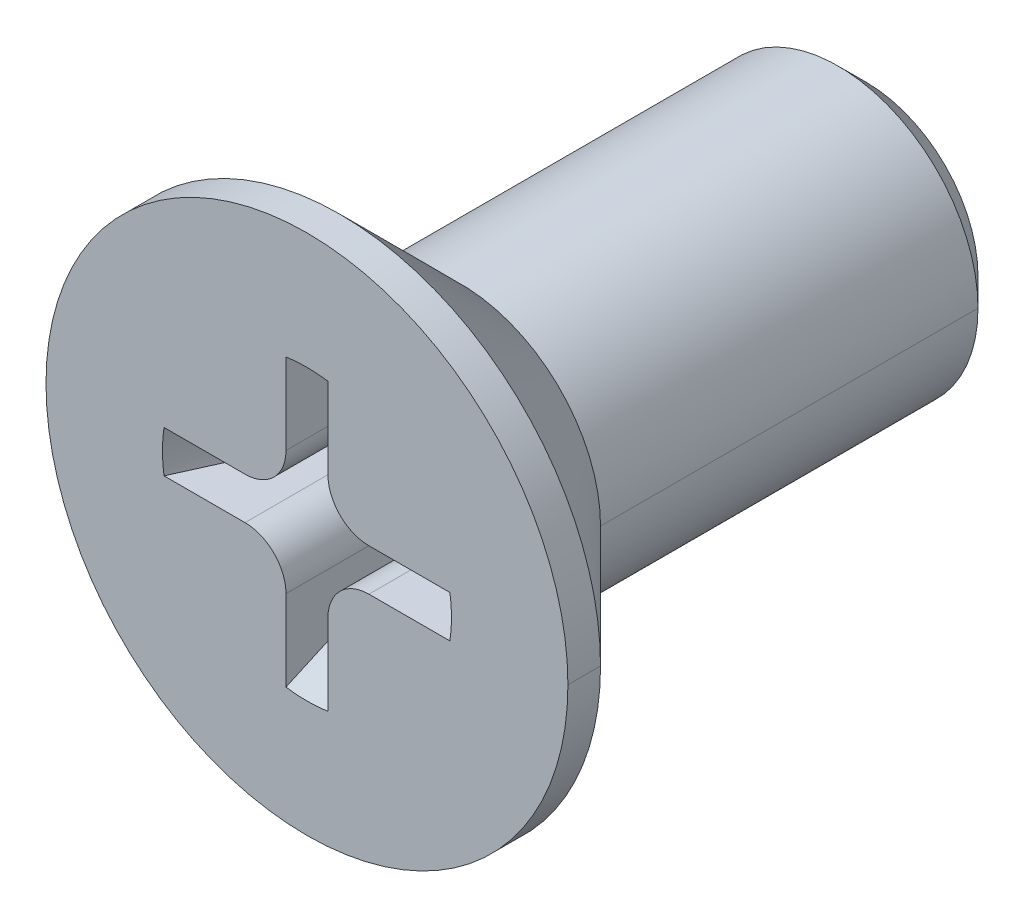
ISO-10303-21;
HEADER;
FILE_DESCRIPTION(('STEP AP214'),'2;1');
FILE_NAME('part.step','',(''),(''),'','','');
FILE_SCHEMA(('AUTOMOTIVE_DESIGN { 1 0 10303 214 1 1 1 1 }'));
ENDSEC;
DATA;
#1=APPLICATION_CONTEXT('core data for automotive mechanical design processes');
#2=APPLICATION_PROTOCOL_DEFINITION('international standard','automotive_design',2000,#1);
#3=PRODUCT_CONTEXT('',#1,'mechanical');
#4=PRODUCT('Part','Part','',(#3));
#5=PRODUCT_RELATED_PRODUCT_CATEGORY('part','',(#4));
#6=PRODUCT_DEFINITION_FORMATION('','',#4);
#7=PRODUCT_DEFINITION_CONTEXT('part definition',#1,'design');
#8=PRODUCT_DEFINITION('design','',#6,#7);
#9=PRODUCT_DEFINITION_SHAPE('','',#8);
#10=(LENGTH_UNIT() NAMED_UNIT(*) SI_UNIT(.MILLI.,.METRE.));
#11=(NAMED_UNIT(*) PLANE_ANGLE_UNIT() SI_UNIT($,.RADIAN.));
#12=(NAMED_UNIT(*) SI_UNIT($,.STERADIAN.) SOLID_ANGLE_UNIT());
#13=UNCERTAINTY_MEASURE_WITH_UNIT(LENGTH_MEASURE(1.E-05),#10,'distance_accuracy_value','');
#14=(GEOMETRIC_REPRESENTATION_CONTEXT(3) GLOBAL_UNCERTAINTY_ASSIGNED_CONTEXT((#13)) GLOBAL_UNIT_ASSIGNED_CONTEXT((#10,
#11,#12)) REPRESENTATION_CONTEXT('',''));
#15=CARTESIAN_POINT('',(0.,0.,0.));
#16=DIRECTION('',(0.,0.,1.));
#17=DIRECTION('',(1.,0.,0.));
#18=AXIS2_PLACEMENT_3D('',#15,#16,#17);
#19=CARTESIAN_POINT('',(0.,0.,1.65));
#20=DIRECTION('',(0.,0.,1.));
#21=DIRECTION('',(1.,0.,0.));
#22=AXIS2_PLACEMENT_3D('',#19,#20,#21);
#23=PLANE('',#22);
#24=CARTESIAN_POINT('',(0.665002947104029,-0.665002947104029,1.65));
#25=DIRECTION('',(0.,0.,-1.));
#26=DIRECTION('',(-0.999999999977569,6.69791883928813E-06,0.));
#27=AXIS2_PLACEMENT_3D('',#24,#25,#26);
#28=CIRCLE('',#27,0.440002947113899);
#29=CARTESIAN_POINT('',(0.225,-0.665,1.65));
#30=VERTEX_POINT('',#29);
#31=CARTESIAN_POINT('',(0.665,-0.225,1.65));
#32=VERTEX_POINT('',#31);
#33=EDGE_CURVE('E11',#30,#32,#28,.T.);
#34=ORIENTED_EDGE('',*,*,#33,.F.);
#35=DIRECTION('',(0.,1.,0.));
#36=VECTOR('',#35,1.);
#37=CARTESIAN_POINT('',(0.225,-1.5335824073065,1.65));
#38=LINE('',#37,#36);
#39=CARTESIAN_POINT('',(0.225000000000073,-1.53358240730625,1.6500000000001));
#40=VERTEX_POINT('',#39);
#41=EDGE_CURVE('E27',#40,#30,#38,.T.);
#42=ORIENTED_EDGE('',*,*,#41,.F.);
#43=CARTESIAN_POINT('',(-1.6623985635289E-07,2.27828563326149E-06,1.65));
#44=DIRECTION('',(0.,0.,1.));
#45=DIRECTION('',(1.07251362713848E-07,-1.,0.));
#46=AXIS2_PLACEMENT_3D('',#43,#44,#45);
#47=CIRCLE('',#46,1.55000227828564);
#48=CARTESIAN_POINT('',(0.,-1.55,1.65));
#49=VERTEX_POINT('',#48);
#50=EDGE_CURVE('E582',#49,#40,#47,.T.);
#51=ORIENTED_EDGE('',*,*,#50,.F.);
#52=CARTESIAN_POINT('',(1.66239870834362E-07,2.27828614085545E-06,1.65));
#53=DIRECTION('',(0.,0.,1.));
#54=DIRECTION('',(-0.145161184207197,-0.989408020282615,0.));
#55=AXIS2_PLACEMENT_3D('',#52,#53,#54);
#56=CIRCLE('',#55,1.55000227828615);
#57=CARTESIAN_POINT('',(-0.225,-1.53358240730663,1.65));
#58=VERTEX_POINT('',#57);
#59=EDGE_CURVE('E591',#58,#49,#56,.T.);
#60=ORIENTED_EDGE('',*,*,#59,.F.);
#61=DIRECTION('',(0.,-1.,0.));
#62=VECTOR('',#61,1.);
#63=CARTESIAN_POINT('',(-0.225,-0.665,1.65));
#64=LINE('',#63,#62);
#65=CARTESIAN_POINT('',(-0.225,-0.665,1.65));
#66=VERTEX_POINT('',#65);
#67=EDGE_CURVE('E583',#66,#58,#64,.T.);
#68=ORIENTED_EDGE('',*,*,#67,.F.);
#69=CARTESIAN_POINT('',(-0.665002947104029,-0.665002947104029,1.65));
#70=DIRECTION('',(0.,0.,-1.));
#71=DIRECTION('',(6.69791883928813E-06,0.999999999977569,0.));
#72=AXIS2_PLACEMENT_3D('',#69,#70,#71);
#73=CIRCLE('',#72,0.440002947113899);
#74=CARTESIAN_POINT('',(-0.665,-0.225,1.65));
#75=VERTEX_POINT('',#74);
#76=EDGE_CURVE('E588',#75,#66,#73,.T.);
#77=ORIENTED_EDGE('',*,*,#76,.F.);
#78=DIRECTION('',(1.,0.,0.));
#79=VECTOR('',#78,1.);
#80=CARTESIAN_POINT('',(-1.5335824073065,-0.225,1.65));
#81=LINE('',#80,#79);
#82=CARTESIAN_POINT('',(-1.53358240730626,-0.224999999999949,1.6500000000001));
#83=VERTEX_POINT('',#82);
#84=EDGE_CURVE('E621',#83,#75,#81,.T.);
#85=ORIENTED_EDGE('',*,*,#84,.F.);
#86=CARTESIAN_POINT('',(2.27828646104377E-06,1.66239894017206E-07,1.65));
#87=DIRECTION('',(0.,0.,1.));
#88=DIRECTION('',(-1.,-1.07251387013314E-07,0.));
#89=AXIS2_PLACEMENT_3D('',#86,#87,#88);
#90=CIRCLE('',#89,1.55000227828647);
#91=CARTESIAN_POINT('',(-1.55,0.,1.65));
#92=VERTEX_POINT('',#91);
#93=EDGE_CURVE('E614',#92,#83,#90,.T.);
#94=ORIENTED_EDGE('',*,*,#93,.F.);
#95=CARTESIAN_POINT('',(2.278286163504E-06,-1.66239872465001E-07,1.65));
#96=DIRECTION('',(0.,0.,1.));
#97=DIRECTION('',(-0.989408020282615,0.145161184207196,0.));
#98=AXIS2_PLACEMENT_3D('',#95,#96,#97);
#99=CIRCLE('',#98,1.55000227828617);
#100=CARTESIAN_POINT('',(-1.53358240730663,0.225,1.65));
#101=VERTEX_POINT('',#100);
#102=EDGE_CURVE('E797',#101,#92,#99,.T.);
#103=ORIENTED_EDGE('',*,*,#102,.F.);
#104=DIRECTION('',(-1.,0.,0.));
#105=VECTOR('',#104,1.);
#106=CARTESIAN_POINT('',(-0.665,0.225,1.65));
#107=LINE('',#106,#105);
#108=CARTESIAN_POINT('',(-0.665,0.225,1.65));
#109=VERTEX_POINT('',#108);
#110=EDGE_CURVE('E670',#109,#101,#107,.T.);
#111=ORIENTED_EDGE('',*,*,#110,.F.);
#112=CARTESIAN_POINT('',(-0.665002947104029,0.665002947104029,1.65));
#113=DIRECTION('',(0.,0.,-1.));
#114=DIRECTION('',(0.999999999977569,-6.69791883903581E-06,0.));
#115=AXIS2_PLACEMENT_3D('',#112,#113,#114);
#116=CIRCLE('',#115,0.440002947113898);
#117=CARTESIAN_POINT('',(-0.225,0.665,1.65));
#118=VERTEX_POINT('',#117);
#119=EDGE_CURVE('E395',#118,#109,#116,.T.);
#120=ORIENTED_EDGE('',*,*,#119,.F.);
#121=DIRECTION('',(0.,-1.,0.));
#122=VECTOR('',#121,1.);
#123=CARTESIAN_POINT('',(-0.225,1.5335824073065,1.65));
#124=LINE('',#123,#122);
#125=CARTESIAN_POINT('',(-0.224999999999949,1.53358240730626,1.6500000000001));
#126=VERTEX_POINT('',#125);
#127=EDGE_CURVE('E392',#126,#118,#124,.T.);
#128=ORIENTED_EDGE('',*,*,#127,.F.);
#129=CARTESIAN_POINT('',(1.6623989204656E-07,-2.27828643373229E-06,1.65));
#130=DIRECTION('',(0.,0.,1.));
#131=DIRECTION('',(-1.07251385741933E-07,1.,0.));
#132=AXIS2_PLACEMENT_3D('',#129,#130,#131);
#133=CIRCLE('',#132,1.55000227828644);
#134=CARTESIAN_POINT('',(0.,1.55,1.65));
#135=VERTEX_POINT('',#134);
#136=EDGE_CURVE('E399',#135,#126,#133,.T.);
#137=ORIENTED_EDGE('',*,*,#136,.F.);
#138=CARTESIAN_POINT('',(-1.66239870938445E-07,-2.27828614218773E-06,1.65));
#139=DIRECTION('',(0.,0.,1.));
#140=DIRECTION('',(0.145161184207197,0.989408020282615,0.));
#141=AXIS2_PLACEMENT_3D('',#138,#139,#140);
#142=CIRCLE('',#141,1.55000227828615);
#143=CARTESIAN_POINT('',(0.225,1.53358240730663,1.65));
#144=VERTEX_POINT('',#143);
#145=EDGE_CURVE('E174',#144,#135,#142,.T.);
#146=ORIENTED_EDGE('',*,*,#145,.F.);
#147=DIRECTION('',(0.,1.,0.));
#148=VECTOR('',#147,1.);
#149=CARTESIAN_POINT('',(0.225,0.665,1.65));
#150=LINE('',#149,#148);
#151=CARTESIAN_POINT('',(0.225,0.665,1.65));
#152=VERTEX_POINT('',#151);
#153=EDGE_CURVE('E167',#152,#144,#150,.T.);
#154=ORIENTED_EDGE('',*,*,#153,.F.);
#155=CARTESIAN_POINT('',(0.665002947104029,0.665002947104029,1.65));
#156=DIRECTION('',(0.,0.,-1.));
#157=DIRECTION('',(-6.69791883928813E-06,-0.999999999977569,0.));
#158=AXIS2_PLACEMENT_3D('',#155,#156,#157);
#159=CIRCLE('',#158,0.440002947113899);
#160=CARTESIAN_POINT('',(0.665,0.225,1.65));
#161=VERTEX_POINT('',#160);
#162=EDGE_CURVE('E190',#161,#152,#159,.T.);
#163=ORIENTED_EDGE('',*,*,#162,.F.);
#164=DIRECTION('',(-1.,0.,0.));
#165=VECTOR('',#164,1.);
#166=CARTESIAN_POINT('',(1.5335824073065,0.225,1.65));
#167=LINE('',#166,#165);
#168=CARTESIAN_POINT('',(1.53358240730626,0.224999999999948,1.6500000000001));
#169=VERTEX_POINT('',#168);
#170=EDGE_CURVE('E265',#169,#161,#167,.T.);
#171=ORIENTED_EDGE('',*,*,#170,.F.);
#172=CARTESIAN_POINT('',(-2.27828557486376E-06,-1.66239852050776E-07,1.65));
#173=DIRECTION('',(0.,0.,1.));
#174=DIRECTION('',(1.,1.07251359938298E-07,0.));
#175=AXIS2_PLACEMENT_3D('',#172,#173,#174);
#176=CIRCLE('',#175,1.55000227828558);
#177=CARTESIAN_POINT('',(1.54999999999976,0.,1.6500000000001));
#178=VERTEX_POINT('',#177);
#179=EDGE_CURVE('E254',#178,#169,#176,.T.);
#180=ORIENTED_EDGE('',*,*,#179,.F.);
#181=CARTESIAN_POINT('',(-2.27828558885257E-06,1.66239853251204E-07,1.65));
#182=DIRECTION('',(0.,0.,1.));
#183=DIRECTION('',(0.98940802028261,-0.145161184207237,0.));
#184=AXIS2_PLACEMENT_3D('',#181,#182,#183);
#185=CIRCLE('',#184,1.5500022782856);
#186=CARTESIAN_POINT('',(1.53358240730663,-0.225,1.65));
#187=VERTEX_POINT('',#186);
#188=EDGE_CURVE('E471',#187,#178,#185,.T.);
#189=ORIENTED_EDGE('',*,*,#188,.F.);
#190=DIRECTION('',(1.,0.,0.));
#191=VECTOR('',#190,1.);
#192=CARTESIAN_POINT('',(0.665,-0.225,1.65));
#193=LINE('',#192,#191);
#194=EDGE_CURVE('E478',#32,#187,#193,.T.);
#195=ORIENTED_EDGE('',*,*,#194,.F.);
#196=EDGE_LOOP('',(#34,#42,#51,#60,#68,#77,#85,#94,#103,#111,#120,#128,#137,#146,#154,#163,#171,
#180,#189,#195));
#197=FACE_BOUND('',#196,.T.);
#198=CARTESIAN_POINT('',(0.,0.,1.65));
#199=DIRECTION('',(0.,0.,-1.));
#200=DIRECTION('',(1.,0.,0.));
#201=AXIS2_PLACEMENT_3D('',#198,#199,#200);
#202=CIRCLE('',#201,2.8);
#203=CARTESIAN_POINT('',(2.8,0.,1.65));
#204=VERTEX_POINT('',#203);
#205=CARTESIAN_POINT('',(-2.8,0.,1.65));
#206=VERTEX_POINT('',#205);
#207=EDGE_CURVE('E442',#204,#206,#202,.T.);
#208=ORIENTED_EDGE('',*,*,#207,.F.);
#209=CARTESIAN_POINT('',(0.,0.,1.65));
#210=DIRECTION('',(0.,0.,-1.));
#211=DIRECTION('',(-1.,0.,0.));
#212=AXIS2_PLACEMENT_3D('',#209,#210,#211);
#213=CIRCLE('',#212,2.8);
#214=EDGE_CURVE('E460',#206,#204,#213,.T.);
#215=ORIENTED_EDGE('',*,*,#214,.F.);
#216=EDGE_LOOP('',(#208,#215));
#217=FACE_BOUND('',#216,.T.);
#218=ADVANCED_FACE('F16',(#197,#217),#23,.T.);
#219=CARTESIAN_POINT('',(0.665,-0.665,-0.35));
#220=DIRECTION('',(0.,0.,1.));
#221=DIRECTION('',(1.,0.,0.));
#222=AXIS2_PLACEMENT_3D('',#219,#220,#221);
#223=CYLINDRICAL_SURFACE('',#222,0.44);
#224=CARTESIAN_POINT('',(0.664977290622299,-0.664977284049876,-0.35));
#225=DIRECTION('',(0.,0.,-1.));
#226=DIRECTION('',(0.707206493153023,0.707007055157304,0.));
#227=AXIS2_PLACEMENT_3D('',#224,#225,#226);
#228=ELLIPSE('',#227,0.439987856251321,0.439966630410474);
#229=CARTESIAN_POINT('',(0.227347754998727,-0.619607132219182,-0.35));
#230=VERTEX_POINT('',#229);
#231=CARTESIAN_POINT('',(0.61960713221919,-0.227347754998725,-0.35));
#232=VERTEX_POINT('',#231);
#233=EDGE_CURVE('E652',#230,#232,#228,.T.);
#234=ORIENTED_EDGE('',*,*,#233,.F.);
#235=CARTESIAN_POINT('',(0.225,-0.665,-0.25554435333));
#236=CARTESIAN_POINT('',(0.224997571030968,-0.65997447042085,-0.266255527915319));
#237=CARTESIAN_POINT('',(0.225172256916278,-0.649935604485502,-0.287478048101881));
#238=CARTESIAN_POINT('',(0.225949123875576,-0.634798395531344,-0.318967052463015));
#239=CARTESIAN_POINT('',(0.226825774706782,-0.624664497369858,-0.339721775285891));
#240=CARTESIAN_POINT('',(0.227347754998772,-0.619607132218977,-0.35));
#241=(BOUNDED_CURVE() B_SPLINE_CURVE(3,(#235,#236,#237,#238,#239,#240),.UNSPECIFIED.,.F.,
.F.) B_SPLINE_CURVE_WITH_KNOTS((4,1,1,4),(0.,0.338549547031321,0.6718829113483,1.),
.UNSPECIFIED.) CURVE() GEOMETRIC_REPRESENTATION_ITEM() RATIONAL_B_SPLINE_CURVE((1.,1.,1.,1.,1.,1.)) REPRESENTATION_ITEM(''));
#242=CARTESIAN_POINT('',(0.225000000000029,-0.664999999998278,-0.25554435333355));
#243=VERTEX_POINT('',#242);
#244=EDGE_CURVE('E527',#243,#230,#241,.T.);
#245=ORIENTED_EDGE('',*,*,#244,.F.);
#246=DIRECTION('',(0.,0.,-1.));
#247=VECTOR('',#246,1.);
#248=CARTESIAN_POINT('',(0.225,-0.665,1.65));
#249=LINE('',#248,#247);
#250=EDGE_CURVE('E732',#30,#243,#249,.T.);
#251=ORIENTED_EDGE('',*,*,#250,.F.);
#252=ORIENTED_EDGE('',*,*,#33,.T.);
#253=DIRECTION('',(0.,0.,1.));
#254=VECTOR('',#253,1.);
#255=CARTESIAN_POINT('',(0.665,-0.225,-0.25554435333));
#256=LINE('',#255,#254);
#257=CARTESIAN_POINT('',(0.665,-0.225,-0.255544353330121));
#258=VERTEX_POINT('',#257);
#259=EDGE_CURVE('E472',#258,#32,#256,.T.);
#260=ORIENTED_EDGE('',*,*,#259,.F.);
#261=CARTESIAN_POINT('',(0.619607132218976,-0.227347754998772,-0.35));
#262=CARTESIAN_POINT('',(0.624664497369473,-0.226825774706822,-0.339721775286733));
#263=CARTESIAN_POINT('',(0.634798395530588,-0.225949123875634,-0.318967052464709));
#264=CARTESIAN_POINT('',(0.649935604484744,-0.225172256916297,-0.287478048103574));
#265=CARTESIAN_POINT('',(0.659974470420473,-0.224997571030967,-0.266255527916167));
#266=CARTESIAN_POINT('',(0.665,-0.225,-0.25554435333));
#267=(BOUNDED_CURVE() B_SPLINE_CURVE(3,(#261,#262,#263,#264,#265,#266),.UNSPECIFIED.,.F.,
.F.) B_SPLINE_CURVE_WITH_KNOTS((4,1,1,4),(0.,0.328117088625176,0.661450452942137,1.),
.UNSPECIFIED.) CURVE() GEOMETRIC_REPRESENTATION_ITEM() RATIONAL_B_SPLINE_CURVE((1.,1.,1.,1.,1.,1.)) REPRESENTATION_ITEM(''));
#268=EDGE_CURVE('E270',#232,#258,#267,.T.);
#269=ORIENTED_EDGE('',*,*,#268,.F.);
#270=EDGE_LOOP('',(#234,#245,#251,#252,#260,#269));
#271=FACE_BOUND('',#270,.T.);
#272=ADVANCED_FACE('F314',(#271),#223,.T.);
#273=CARTESIAN_POINT('',(0.225,-0.665,-0.35));
#274=DIRECTION('',(1.,0.,0.));
#275=DIRECTION('',(0.,-1.,0.));
#276=AXIS2_PLACEMENT_3D('',#273,#274,#275);
#277=PLANE('',#276);
#278=ORIENTED_EDGE('',*,*,#41,.T.);
#279=ORIENTED_EDGE('',*,*,#250,.T.);
#280=CARTESIAN_POINT('',(0.225,-0.664999999994835,-0.25554435334065));
#281=CARTESIAN_POINT('',(0.225,-0.953573853390657,0.35986159446315));
#282=CARTESIAN_POINT('',(0.225,-1.53358240730574,1.65000000000032));
#283=B_SPLINE_CURVE_WITH_KNOTS('',2,(#280,#281,#282),.UNSPECIFIED.,.F.,.F.,(3,3),(0.,1.),.UNSPECIFIED.);
#284=EDGE_CURVE('E511',#243,#40,#283,.T.);
#285=ORIENTED_EDGE('',*,*,#284,.T.);
#286=EDGE_LOOP('',(#278,#279,#285));
#287=FACE_BOUND('',#286,.T.);
#288=ADVANCED_FACE('F317',(#287),#277,.F.);
#289=CARTESIAN_POINT('',(0.,0.,0.414044943820969));
#290=DIRECTION('',(0.,0.,1.));
#291=DIRECTION('',(1.,0.,0.));
#292=AXIS2_PLACEMENT_3D('',#289,#290,#291);
#293=CONICAL_SURFACE('',#292,1.,0.418688151438);
#294=ORIENTED_EDGE('',*,*,#244,.T.);
#295=CARTESIAN_POINT('',(0.,9.42262228920132E-06,-0.35));
#296=DIRECTION('',(0.,0.,1.));
#297=DIRECTION('',(-0.344461678646605,-0.938800379177577,0.));
#298=AXIS2_PLACEMENT_3D('',#295,#296,#297);
#299=CIRCLE('',#298,0.660008845953364);
#300=CARTESIAN_POINT('',(-0.227347754998727,-0.619607132219182,-0.35));
#301=VERTEX_POINT('',#300);
#302=EDGE_CURVE('E654',#301,#230,#299,.T.);
#303=ORIENTED_EDGE('',*,*,#302,.F.);
#304=CARTESIAN_POINT('',(-0.227347754998772,-0.619607132218976,-0.35));
#305=CARTESIAN_POINT('',(-0.226825774761878,-0.624664496662959,-0.339721774741337));
#306=CARTESIAN_POINT('',(-0.225949124010801,-0.634798393838425,-0.31896705123648));
#307=CARTESIAN_POINT('',(-0.225172256955513,-0.649935602794808,-0.287478046895877));
#308=CARTESIAN_POINT('',(-0.224997571049289,-0.659974469699923,-0.266255527370977));
#309=CARTESIAN_POINT('',(-0.225,-0.665,-0.25554435333));
#310=(BOUNDED_CURVE() B_SPLINE_CURVE(3,(#304,#305,#306,#307,#308,#309),.UNSPECIFIED.,.F.,
.F.) B_SPLINE_CURVE_WITH_KNOTS((4,1,1,4),(0.,0.328117093794362,0.66145045814854,1.),
.UNSPECIFIED.) CURVE() GEOMETRIC_REPRESENTATION_ITEM() RATIONAL_B_SPLINE_CURVE((1.,1.,1.,1.,1.,1.)) REPRESENTATION_ITEM(''));
#311=CARTESIAN_POINT('',(-0.225,-0.665,-0.255544353330121));
#312=VERTEX_POINT('',#311);
#313=EDGE_CURVE('E564',#301,#312,#310,.T.);
#314=ORIENTED_EDGE('',*,*,#313,.T.);
#315=CARTESIAN_POINT('',(-0.224999999999924,-0.664999999999773,-0.255544353330256));
#316=CARTESIAN_POINT('',(-0.225039006148654,-0.695463201823479,-0.19064683696447));
#317=CARTESIAN_POINT('',(-0.225086501672703,-0.725767506974524,-0.125675169622548));
#318=CARTESIAN_POINT('',(-0.225171058228035,-0.790505041385292,0.0137910008785289));
#319=CARTESIAN_POINT('',(-0.225205614164587,-0.824901066167323,0.0883027847754375));
#320=CARTESIAN_POINT('',(-0.225203785316268,-0.897833980861553,0.246846581908908));
#321=CARTESIAN_POINT('',(-0.225157875366268,-0.936344379953647,0.330890759752385));
#322=CARTESIAN_POINT('',(-0.225060542602073,-1.01748670986774,0.508505940217321));
#323=CARTESIAN_POINT('',(-0.225009079481206,-1.06009600758011,0.602087281109612));
#324=CARTESIAN_POINT('',(-0.224992614834694,-1.1343516547518,0.765577847910059));
#325=CARTESIAN_POINT('',(-0.225008990381767,-1.16603681662718,0.835469458075799));
#326=CARTESIAN_POINT('',(-0.225030923079399,-1.23223109922416,0.981672112662301));
#327=CARTESIAN_POINT('',(-0.225035354838135,-1.26673367839136,1.05798611842399));
#328=CARTESIAN_POINT('',(-0.225033062119772,-1.33856140035044,1.21703459776615));
#329=CARTESIAN_POINT('',(-0.225025372364861,-1.37588096477277,1.29977159000752));
#330=CARTESIAN_POINT('',(-0.22500917770224,-1.45334003480729,1.47166689740909));
#331=CARTESIAN_POINT('',(-0.225000655718692,-1.49347462962998,1.56082742568455));
#332=CARTESIAN_POINT('',(-0.224999999999854,-1.53358240730586,1.65000000000047));
#333=B_SPLINE_CURVE_WITH_KNOTS('',3,(#315,#316,#317,#318,#319,#320,#321,#322,#323,#324,#325,
#326,#327,#328,#329,#330,#331,#332),.UNSPECIFIED.,.F.,.F.,(4,2,2,2,2,2,2,2,4),(0.,
0.215074239227004,0.461276463354804,0.738617679825519,1.04709299854529,1.27730824681175,
1.52856166373092,1.80085456485191,2.09418619692445),.UNSPECIFIED.);
#334=EDGE_CURVE('E559',#312,#58,#333,.T.);
#335=ORIENTED_EDGE('',*,*,#334,.T.);
#336=ORIENTED_EDGE('',*,*,#59,.T.);
#337=ORIENTED_EDGE('',*,*,#50,.T.);
#338=ORIENTED_EDGE('',*,*,#284,.F.);
#339=EDGE_LOOP('',(#294,#303,#314,#335,#336,#337,#338));
#340=FACE_BOUND('',#339,.T.);
#341=ADVANCED_FACE('F529',(#340),#293,.F.);
#342=CARTESIAN_POINT('',(-0.225,-1.55,-0.35));
#343=DIRECTION('',(-1.,0.,0.));
#344=DIRECTION('',(0.,1.,0.));
#345=AXIS2_PLACEMENT_3D('',#342,#343,#344);
#346=PLANE('',#345);
#347=DIRECTION('',(0.,0.,1.));
#348=VECTOR('',#347,1.);
#349=CARTESIAN_POINT('',(-0.225,-0.665,-0.25554435333));
#350=LINE('',#349,#348);
#351=EDGE_CURVE('E576',#312,#66,#350,.T.);
#352=ORIENTED_EDGE('',*,*,#351,.T.);
#353=ORIENTED_EDGE('',*,*,#67,.T.);
#354=ORIENTED_EDGE('',*,*,#334,.F.);
#355=EDGE_LOOP('',(#352,#353,#354));
#356=FACE_BOUND('',#355,.T.);
#357=ADVANCED_FACE('F539',(#356),#346,.F.);
#358=CARTESIAN_POINT('',(-0.665,-0.665,-0.35));
#359=DIRECTION('',(0.,0.,1.));
#360=DIRECTION('',(1.,0.,0.));
#361=AXIS2_PLACEMENT_3D('',#358,#359,#360);
#362=CYLINDRICAL_SURFACE('',#361,0.44);
#363=CARTESIAN_POINT('',(-0.664977284049926,-0.664977290622335,-0.35));
#364=DIRECTION('',(0.,0.,-1.));
#365=DIRECTION('',(-0.707007055323126,0.707206492987248,0.));
#366=AXIS2_PLACEMENT_3D('',#363,#364,#365);
#367=ELLIPSE('',#366,0.439987856251347,0.439966630410535);
#368=CARTESIAN_POINT('',(-0.61960713221919,-0.227347754998725,-0.35));
#369=VERTEX_POINT('',#368);
#370=EDGE_CURVE('E655',#369,#301,#367,.T.);
#371=ORIENTED_EDGE('',*,*,#370,.F.);
#372=CARTESIAN_POINT('',(-0.665,-0.225,-0.25554435333));
#373=CARTESIAN_POINT('',(-0.659974470421008,-0.224997571030964,-0.266255527915444));
#374=CARTESIAN_POINT('',(-0.649935604485872,-0.22517225691627,-0.287478048102156));
#375=CARTESIAN_POINT('',(-0.634798395531756,-0.225949123875543,-0.318967052463315));
#376=CARTESIAN_POINT('',(-0.624664497370031,-0.226825774706769,-0.339721775286023));
#377=CARTESIAN_POINT('',(-0.619607132218977,-0.227347754998772,-0.35));
#378=(BOUNDED_CURVE() B_SPLINE_CURVE(3,(#372,#373,#374,#375,#376,#377),.UNSPECIFIED.,.F.,
.F.) B_SPLINE_CURVE_WITH_KNOTS((4,1,1,4),(0.,0.338549547032616,0.671882911349549,1.),
.UNSPECIFIED.) CURVE() GEOMETRIC_REPRESENTATION_ITEM() RATIONAL_B_SPLINE_CURVE((1.,1.,1.,1.,1.,1.)) REPRESENTATION_ITEM(''));
#379=CARTESIAN_POINT('',(-0.665000000000189,-0.224999999999983,-0.255544353329517));
#380=VERTEX_POINT('',#379);
#381=EDGE_CURVE('E611',#380,#369,#378,.T.);
#382=ORIENTED_EDGE('',*,*,#381,.F.);
#383=DIRECTION('',(0.,0.,-1.));
#384=VECTOR('',#383,1.);
#385=CARTESIAN_POINT('',(-0.665,-0.225,1.65));
#386=LINE('',#385,#384);
#387=EDGE_CURVE('E617',#75,#380,#386,.T.);
#388=ORIENTED_EDGE('',*,*,#387,.F.);
#389=ORIENTED_EDGE('',*,*,#76,.T.);
#390=ORIENTED_EDGE('',*,*,#351,.F.);
#391=ORIENTED_EDGE('',*,*,#313,.F.);
#392=EDGE_LOOP('',(#371,#382,#388,#389,#390,#391));
#393=FACE_BOUND('',#392,.T.);
#394=ADVANCED_FACE('F681',(#393),#362,.T.);
#395=CARTESIAN_POINT('',(-0.665,-0.225,-0.35));
#396=DIRECTION('',(0.,-1.,0.));
#397=DIRECTION('',(-1.,0.,0.));
#398=AXIS2_PLACEMENT_3D('',#395,#396,#397);
#399=PLANE('',#398);
#400=ORIENTED_EDGE('',*,*,#84,.T.);
#401=ORIENTED_EDGE('',*,*,#387,.T.);
#402=CARTESIAN_POINT('',(-0.665000000000565,-0.225,-0.255544353328551));
#403=CARTESIAN_POINT('',(-0.953573853393273,-0.225,0.35986159446943));
#404=CARTESIAN_POINT('',(-1.53358240730579,-0.225,1.65000000000032));
#405=B_SPLINE_CURVE_WITH_KNOTS('',2,(#402,#403,#404),.UNSPECIFIED.,.F.,.F.,(3,3),(0.,1.),.UNSPECIFIED.);
#406=EDGE_CURVE('E602',#380,#83,#405,.T.);
#407=ORIENTED_EDGE('',*,*,#406,.T.);
#408=EDGE_LOOP('',(#400,#401,#407));
#409=FACE_BOUND('',#408,.T.);
#410=ADVANCED_FACE('F233',(#409),#399,.F.);
#411=CARTESIAN_POINT('',(0.,0.,0.414044943820969));
#412=DIRECTION('',(0.,0.,1.));
#413=DIRECTION('',(1.,0.,0.));
#414=AXIS2_PLACEMENT_3D('',#411,#412,#413);
#415=CONICAL_SURFACE('',#414,1.,0.418688151438);
#416=ORIENTED_EDGE('',*,*,#93,.T.);
#417=ORIENTED_EDGE('',*,*,#406,.F.);
#418=ORIENTED_EDGE('',*,*,#381,.T.);
#419=CARTESIAN_POINT('',(5.59334873651007E-06,9.93770141677342E-07,-0.35));
#420=DIRECTION('',(0.,0.,1.));
#421=DIRECTION('',(-0.999999999998867,-1.50569957541424E-06,0.));
#422=AXIS2_PLACEMENT_3D('',#419,#420,#421);
#423=CIRCLE('',#422,0.660005593349485);
#424=CARTESIAN_POINT('',(-0.66,0.,-0.35));
#425=VERTEX_POINT('',#424);
#426=EDGE_CURVE('E440',#425,#369,#423,.T.);
#427=ORIENTED_EDGE('',*,*,#426,.F.);
#428=CARTESIAN_POINT('',(5.59334928462718E-06,-9.93770239127168E-07,-0.35));
#429=DIRECTION('',(0.,0.,1.));
#430=DIRECTION('',(-0.93879920384246,0.344464881903458,0.));
#431=AXIS2_PLACEMENT_3D('',#428,#429,#430);
#432=CIRCLE('',#431,0.660005593350033);
#433=CARTESIAN_POINT('',(-0.61960713221919,0.227347754998725,-0.35));
#434=VERTEX_POINT('',#433);
#435=EDGE_CURVE('E436',#434,#425,#432,.T.);
#436=ORIENTED_EDGE('',*,*,#435,.F.);
#437=CARTESIAN_POINT('',(-0.619607132218976,0.227347754998772,-0.35));
#438=CARTESIAN_POINT('',(-0.624664497369488,0.226825774706821,-0.339721775286745));
#439=CARTESIAN_POINT('',(-0.634798395530623,0.225949123875631,-0.318967052464735));
#440=CARTESIAN_POINT('',(-0.649935604484773,0.225172256916297,-0.287478048103597));
#441=CARTESIAN_POINT('',(-0.659974470420485,0.224997571030967,-0.266255527916177));
#442=CARTESIAN_POINT('',(-0.665,0.225,-0.25554435333));
#443=(BOUNDED_CURVE() B_SPLINE_CURVE(3,(#437,#438,#439,#440,#441,#442),.UNSPECIFIED.,.F.,
.F.) B_SPLINE_CURVE_WITH_KNOTS((4,1,1,4),(0.,0.328117088625067,0.661450452942024,1.),
.UNSPECIFIED.) CURVE() GEOMETRIC_REPRESENTATION_ITEM() RATIONAL_B_SPLINE_CURVE((1.,1.,1.,1.,1.,1.)) REPRESENTATION_ITEM(''));
#444=CARTESIAN_POINT('',(-0.665,0.225,-0.255544353330121));
#445=VERTEX_POINT('',#444);
#446=EDGE_CURVE('E358',#434,#445,#443,.T.);
#447=ORIENTED_EDGE('',*,*,#446,.T.);
#448=CARTESIAN_POINT('',(-0.664999999999774,0.224999999999922,-0.255544353330256));
#449=CARTESIAN_POINT('',(-0.695463201822251,0.225039006148682,-0.19064683696706));
#450=CARTESIAN_POINT('',(-0.725767506972063,0.22508650167284,-0.125675169627727));
#451=CARTESIAN_POINT('',(-0.790505041381176,0.225171058228457,0.0137910008698978));
#452=CARTESIAN_POINT('',(-0.824901066162778,0.225205614165193,0.0883027847659458));
#453=CARTESIAN_POINT('',(-0.897833980856979,0.225203785317152,0.246846581899421));
#454=CARTESIAN_POINT('',(-0.936344379949474,0.225157875367228,0.330890759743763));
#455=CARTESIAN_POINT('',(-1.01748670986523,0.225060542602786,0.508505940212149));
#456=CARTESIAN_POINT('',(-1.06009600757886,0.225009079481548,0.602087281107021));
#457=CARTESIAN_POINT('',(-1.13435165474909,0.224992614834447,0.765577847903984));
#458=CARTESIAN_POINT('',(-1.16603681662176,0.225008990381281,0.835469458063649));
#459=CARTESIAN_POINT('',(-1.23223109921512,0.225030923078721,0.981672112642052));
#460=CARTESIAN_POINT('',(-1.2667336783814,0.22503535483753,1.05798611840172));
#461=CARTESIAN_POINT('',(-1.33856140034047,0.225033062119358,1.21703459774388));
#462=CARTESIAN_POINT('',(-1.37588096476369,0.225025372364566,1.29977158998728));
#463=CARTESIAN_POINT('',(-1.45334003480184,0.225009177702148,1.47166689739695));
#464=CARTESIAN_POINT('',(-1.49347462962725,0.22500065571868,1.56082742567848));
#465=CARTESIAN_POINT('',(-1.53358240730586,0.224999999999844,1.65000000000047));
#466=B_SPLINE_CURVE_WITH_KNOTS('',3,(#448,#449,#450,#451,#452,#453,#454,#455,#456,#457,#458,
#459,#460,#461,#462,#463,#464,#465),.UNSPECIFIED.,.F.,.F.,(4,2,2,2,2,2,2,2,4),(0.,
0.215074239218403,0.46127646334332,0.738617679816896,1.04709299854529,1.2773082467918,
1.5285616637043,1.80085456483194,2.09418619692445),.UNSPECIFIED.);
#467=EDGE_CURVE('E352',#445,#101,#466,.T.);
#468=ORIENTED_EDGE('',*,*,#467,.T.);
#469=ORIENTED_EDGE('',*,*,#102,.T.);
#470=EDGE_LOOP('',(#416,#417,#418,#427,#436,#447,#468,#469));
#471=FACE_BOUND('',#470,.T.);
#472=ADVANCED_FACE('F323',(#471),#415,.F.);
#473=CARTESIAN_POINT('',(-1.55,0.225,-0.35));
#474=DIRECTION('',(0.,1.,0.));
#475=DIRECTION('',(1.,0.,0.));
#476=AXIS2_PLACEMENT_3D('',#473,#474,#475);
#477=PLANE('',#476);
#478=DIRECTION('',(0.,0.,1.));
#479=VECTOR('',#478,1.);
#480=CARTESIAN_POINT('',(-0.665,0.225,-0.25554435333));
#481=LINE('',#480,#479);
#482=EDGE_CURVE('E800',#445,#109,#481,.T.);
#483=ORIENTED_EDGE('',*,*,#482,.T.);
#484=ORIENTED_EDGE('',*,*,#110,.T.);
#485=ORIENTED_EDGE('',*,*,#467,.F.);
#486=EDGE_LOOP('',(#483,#484,#485));
#487=FACE_BOUND('',#486,.T.);
#488=ADVANCED_FACE('F327',(#487),#477,.F.);
#489=CARTESIAN_POINT('',(-0.665,0.665,-0.35));
#490=DIRECTION('',(0.,0.,1.));
#491=DIRECTION('',(1.,0.,0.));
#492=AXIS2_PLACEMENT_3D('',#489,#490,#491);
#493=CYLINDRICAL_SURFACE('',#492,0.44);
#494=CARTESIAN_POINT('',(-0.664977290622316,0.66497728404989,-0.35));
#495=DIRECTION('',(0.,0.,-1.));
#496=DIRECTION('',(0.707206493195876,0.707007055114439,0.));
#497=AXIS2_PLACEMENT_3D('',#494,#495,#496);
#498=ELLIPSE('',#497,0.439987856251331,0.439966630410495);
#499=CARTESIAN_POINT('',(-0.227347754998727,0.619607132219182,-0.35));
#500=VERTEX_POINT('',#499);
#501=EDGE_CURVE('E425',#500,#434,#498,.T.);
#502=ORIENTED_EDGE('',*,*,#501,.F.);
#503=CARTESIAN_POINT('',(-0.225,0.665,-0.25554435333));
#504=CARTESIAN_POINT('',(-0.22499757103127,0.659974470408964,-0.266255527906303));
#505=CARTESIAN_POINT('',(-0.225172256916923,0.649935604457618,-0.287478048081915));
#506=CARTESIAN_POINT('',(-0.225949123877817,0.634798395503272,-0.318967052442637));
#507=CARTESIAN_POINT('',(-0.226825774707695,0.624664497358136,-0.339721775276843));
#508=CARTESIAN_POINT('',(-0.227347754998772,0.619607132218977,-0.35));
#509=(BOUNDED_CURVE() B_SPLINE_CURVE(3,(#503,#504,#505,#506,#507,#508),.UNSPECIFIED.,.F.,
.F.) B_SPLINE_CURVE_WITH_KNOTS((4,1,1,4),(0.,0.338549546944847,0.671882911262579,1.),
.UNSPECIFIED.) CURVE() GEOMETRIC_REPRESENTATION_ITEM() RATIONAL_B_SPLINE_CURVE((1.,1.,1.,1.,1.,1.)) REPRESENTATION_ITEM(''));
#510=CARTESIAN_POINT('',(-0.224999999999983,0.665000000000183,-0.255544353329529));
#511=VERTEX_POINT('',#510);
#512=EDGE_CURVE('E185',#511,#500,#509,.T.);
#513=ORIENTED_EDGE('',*,*,#512,.F.);
#514=DIRECTION('',(0.,0.,-1.));
#515=VECTOR('',#514,1.);
#516=CARTESIAN_POINT('',(-0.225,0.665,1.65));
#517=LINE('',#516,#515);
#518=EDGE_CURVE('E396',#118,#511,#517,.T.);
#519=ORIENTED_EDGE('',*,*,#518,.F.);
#520=ORIENTED_EDGE('',*,*,#119,.T.);
#521=ORIENTED_EDGE('',*,*,#482,.F.);
#522=ORIENTED_EDGE('',*,*,#446,.F.);
#523=EDGE_LOOP('',(#502,#513,#519,#520,#521,#522));
#524=FACE_BOUND('',#523,.T.);
#525=ADVANCED_FACE('F369',(#524),#493,.T.);
#526=CARTESIAN_POINT('',(-0.225,0.665,-0.35));
#527=DIRECTION('',(-1.,0.,0.));
#528=DIRECTION('',(0.,1.,0.));
#529=AXIS2_PLACEMENT_3D('',#526,#527,#528);
#530=PLANE('',#529);
#531=ORIENTED_EDGE('',*,*,#127,.T.);
#532=ORIENTED_EDGE('',*,*,#518,.T.);
#533=CARTESIAN_POINT('',(-0.225,0.665000000000549,-0.255544353328585));
#534=CARTESIAN_POINT('',(-0.225,0.953573853393285,0.359861594469456));
#535=CARTESIAN_POINT('',(-0.225,1.53358240730579,1.65000000000032));
#536=B_SPLINE_CURVE_WITH_KNOTS('',2,(#533,#534,#535),.UNSPECIFIED.,.F.,.F.,(3,3),(0.,1.),.UNSPECIFIED.);
#537=EDGE_CURVE('E402',#511,#126,#536,.T.);
#538=ORIENTED_EDGE('',*,*,#537,.T.);
#539=EDGE_LOOP('',(#531,#532,#538));
#540=FACE_BOUND('',#539,.T.);
#541=ADVANCED_FACE('F374',(#540),#530,.F.);
#542=CARTESIAN_POINT('',(0.,0.,0.414044943820969));
#543=DIRECTION('',(0.,0.,1.));
#544=DIRECTION('',(1.,0.,0.));
#545=AXIS2_PLACEMENT_3D('',#542,#543,#544);
#546=CONICAL_SURFACE('',#545,1.,0.418688151438);
#547=ORIENTED_EDGE('',*,*,#136,.T.);
#548=ORIENTED_EDGE('',*,*,#537,.F.);
#549=ORIENTED_EDGE('',*,*,#512,.T.);
#550=CARTESIAN_POINT('',(0.,-9.42262228786905E-06,-0.35));
#551=DIRECTION('',(0.,0.,1.));
#552=DIRECTION('',(0.344461678646606,0.938800379177577,0.));
#553=AXIS2_PLACEMENT_3D('',#550,#551,#552);
#554=CIRCLE('',#553,0.660008845953363);
#555=CARTESIAN_POINT('',(0.227347754998727,0.619607132219182,-0.35));
#556=VERTEX_POINT('',#555);
#557=EDGE_CURVE('E181',#556,#500,#554,.T.);
#558=ORIENTED_EDGE('',*,*,#557,.F.);
#559=CARTESIAN_POINT('',(0.227347754998772,0.619607132218977,-0.35));
#560=CARTESIAN_POINT('',(0.226825774706821,0.624664497369481,-0.33972177528674));
#561=CARTESIAN_POINT('',(0.225949123875632,0.634798395530607,-0.318967052464723));
#562=CARTESIAN_POINT('',(0.225172256916297,0.649935604484759,-0.287478048103587));
#563=CARTESIAN_POINT('',(0.224997571030967,0.659974470420479,-0.266255527916173));
#564=CARTESIAN_POINT('',(0.225,0.665,-0.25554435333));
#565=(BOUNDED_CURVE() B_SPLINE_CURVE(3,(#559,#560,#561,#562,#563,#564),.UNSPECIFIED.,.F.,
.F.) B_SPLINE_CURVE_WITH_KNOTS((4,1,1,4),(0.,0.328117088625114,0.661450452942072,1.),
.UNSPECIFIED.) CURVE() GEOMETRIC_REPRESENTATION_ITEM() RATIONAL_B_SPLINE_CURVE((1.,1.,1.,1.,1.,1.)) REPRESENTATION_ITEM(''));
#566=CARTESIAN_POINT('',(0.225,0.665,-0.255544353330121));
#567=VERTEX_POINT('',#566);
#568=EDGE_CURVE('E173',#556,#567,#565,.T.);
#569=ORIENTED_EDGE('',*,*,#568,.T.);
#570=CARTESIAN_POINT('',(0.224999999999924,0.664999999999773,-0.255544353330256));
#571=CARTESIAN_POINT('',(0.225039006148686,0.69546320182215,-0.190646836967272));
#572=CARTESIAN_POINT('',(0.225086501672853,0.725767506971862,-0.125675169628151));
#573=CARTESIAN_POINT('',(0.225171058228494,0.790505041380839,0.0137910008691918));
#574=CARTESIAN_POINT('',(0.225205614165244,0.824901066162406,0.0883027847651694));
#575=CARTESIAN_POINT('',(0.225203785317226,0.897833980856604,0.246846581898645));
#576=CARTESIAN_POINT('',(0.225157875367309,0.936344379949132,0.330890759743058));
#577=CARTESIAN_POINT('',(0.225060542602846,1.01748670986503,0.508505940211725));
#578=CARTESIAN_POINT('',(0.225009079481577,1.06009600757876,0.602087281106809));
#579=CARTESIAN_POINT('',(0.224992614834427,1.13435165474887,0.765577847903486));
#580=CARTESIAN_POINT('',(0.225008990381242,1.16603681662132,0.835469458062652));
#581=CARTESIAN_POINT('',(0.225030923078666,1.23223109921438,0.981672112640392));
#582=CARTESIAN_POINT('',(0.225035354837482,1.26673367838059,1.05798611839989));
#583=CARTESIAN_POINT('',(0.225033062119325,1.33856140033965,1.21703459774206));
#584=CARTESIAN_POINT('',(0.225025372364543,1.37588096476295,1.29977158998562));
#585=CARTESIAN_POINT('',(0.225009177702142,1.45334003480139,1.47166689739595));
#586=CARTESIAN_POINT('',(0.225000655718681,1.49347462962703,1.56082742567799));
#587=CARTESIAN_POINT('',(0.224999999999846,1.53358240730586,1.65000000000047));
#588=B_SPLINE_CURVE_WITH_KNOTS('',3,(#570,#571,#572,#573,#574,#575,#576,#577,#578,#579,#580,
#581,#582,#583,#584,#585,#586,#587),.UNSPECIFIED.,.F.,.F.,(4,2,2,2,2,2,2,2,4),(0.,
0.2150742392177,0.461276463342381,0.738617679816191,1.04709299854529,1.27730824679016,
1.52856166370212,1.8008545648303,2.09418619692445),.UNSPECIFIED.);
#589=EDGE_CURVE('E160',#567,#144,#588,.T.);
#590=ORIENTED_EDGE('',*,*,#589,.T.);
#591=ORIENTED_EDGE('',*,*,#145,.T.);
#592=EDGE_LOOP('',(#547,#548,#549,#558,#569,#590,#591));
#593=FACE_BOUND('',#592,.T.);
#594=ADVANCED_FACE('F178',(#593),#546,.F.);
#595=CARTESIAN_POINT('',(0.225,1.55,-0.35));
#596=DIRECTION('',(1.,0.,0.));
#597=DIRECTION('',(0.,-1.,0.));
#598=AXIS2_PLACEMENT_3D('',#595,#596,#597);
#599=PLANE('',#598);
#600=DIRECTION('',(0.,0.,1.));
#601=VECTOR('',#600,1.);
#602=CARTESIAN_POINT('',(0.225,0.665,-0.25554435333));
#603=LINE('',#602,#601);
#604=EDGE_CURVE('E165',#567,#152,#603,.T.);
#605=ORIENTED_EDGE('',*,*,#604,.T.);
#606=ORIENTED_EDGE('',*,*,#153,.T.);
#607=ORIENTED_EDGE('',*,*,#589,.F.);
#608=EDGE_LOOP('',(#605,#606,#607));
#609=FACE_BOUND('',#608,.T.);
#610=ADVANCED_FACE('F163',(#609),#599,.F.);
#611=CARTESIAN_POINT('',(0.665,0.665,-0.35));
#612=DIRECTION('',(0.,0.,1.));
#613=DIRECTION('',(1.,0.,0.));
#614=AXIS2_PLACEMENT_3D('',#611,#612,#613);
#615=CYLINDRICAL_SURFACE('',#614,0.44);
#616=CARTESIAN_POINT('',(0.664977284049888,0.664977290622295,-0.35));
#617=DIRECTION('',(0.,0.,-1.));
#618=DIRECTION('',(-0.707007055347274,0.707206492963106,0.));
#619=AXIS2_PLACEMENT_3D('',#616,#617,#618);
#620=ELLIPSE('',#619,0.439987856251323,0.439966630410479);
#621=CARTESIAN_POINT('',(0.61960713221919,0.227347754998725,-0.35));
#622=VERTEX_POINT('',#621);
#623=EDGE_CURVE('E426',#622,#556,#620,.T.);
#624=ORIENTED_EDGE('',*,*,#623,.F.);
#625=CARTESIAN_POINT('',(0.665,0.225,-0.25554435333));
#626=CARTESIAN_POINT('',(0.659974470420913,0.224997571030967,-0.26625552791537));
#627=CARTESIAN_POINT('',(0.649935604485649,0.225172256916275,-0.287478048101992));
#628=CARTESIAN_POINT('',(0.634798395531515,0.225949123875563,-0.318967052463139));
#629=CARTESIAN_POINT('',(0.62466449736993,0.226825774706776,-0.339721775285946));
#630=CARTESIAN_POINT('',(0.619607132218976,0.227347754998772,-0.35));
#631=(BOUNDED_CURVE() B_SPLINE_CURVE(3,(#625,#626,#627,#628,#629,#630),.UNSPECIFIED.,.F.,
.F.) B_SPLINE_CURVE_WITH_KNOTS((4,1,1,4),(0.,0.33854954703186,0.671882911348815,1.),
.UNSPECIFIED.) CURVE() GEOMETRIC_REPRESENTATION_ITEM() RATIONAL_B_SPLINE_CURVE((1.,1.,1.,1.,1.,1.)) REPRESENTATION_ITEM(''));
#632=CARTESIAN_POINT('',(0.665000000000188,0.224999999999983,-0.255544353329518));
#633=VERTEX_POINT('',#632);
#634=EDGE_CURVE('E245',#633,#622,#631,.T.);
#635=ORIENTED_EDGE('',*,*,#634,.F.);
#636=DIRECTION('',(0.,0.,-1.));
#637=VECTOR('',#636,1.);
#638=CARTESIAN_POINT('',(0.665,0.225,1.65));
#639=LINE('',#638,#637);
#640=EDGE_CURVE('E259',#161,#633,#639,.T.);
#641=ORIENTED_EDGE('',*,*,#640,.F.);
#642=ORIENTED_EDGE('',*,*,#162,.T.);
#643=ORIENTED_EDGE('',*,*,#604,.F.);
#644=ORIENTED_EDGE('',*,*,#568,.F.);
#645=EDGE_LOOP('',(#624,#635,#641,#642,#643,#644));
#646=FACE_BOUND('',#645,.T.);
#647=ADVANCED_FACE('F187',(#646),#615,.T.);
#648=CARTESIAN_POINT('',(0.665,0.225,-0.35));
#649=DIRECTION('',(0.,1.,0.));
#650=DIRECTION('',(1.,0.,0.));
#651=AXIS2_PLACEMENT_3D('',#648,#649,#650);
#652=PLANE('',#651);
#653=ORIENTED_EDGE('',*,*,#170,.T.);
#654=ORIENTED_EDGE('',*,*,#640,.T.);
#655=CARTESIAN_POINT('',(0.665000000000565,0.225,-0.255544353328552));
#656=CARTESIAN_POINT('',(0.953573853393223,0.225,0.359861594469323));
#657=CARTESIAN_POINT('',(1.53358240730579,0.225,1.65000000000032));
#658=B_SPLINE_CURVE_WITH_KNOTS('',2,(#655,#656,#657),.UNSPECIFIED.,.F.,.F.,(3,3),(0.,1.),.UNSPECIFIED.);
#659=EDGE_CURVE('E216',#633,#169,#658,.T.);
#660=ORIENTED_EDGE('',*,*,#659,.T.);
#661=EDGE_LOOP('',(#653,#654,#660));
#662=FACE_BOUND('',#661,.T.);
#663=ADVANCED_FACE('F222',(#662),#652,.F.);
#664=CARTESIAN_POINT('',(0.,0.,0.414044943820969));
#665=DIRECTION('',(0.,0.,1.));
#666=DIRECTION('',(1.,0.,0.));
#667=AXIS2_PLACEMENT_3D('',#664,#665,#666);
#668=CONICAL_SURFACE('',#667,1.,0.418688151438);
#669=ORIENTED_EDGE('',*,*,#659,.F.);
#670=ORIENTED_EDGE('',*,*,#634,.T.);
#671=CARTESIAN_POINT('',(-5.59334873917461E-06,-9.93770142537764E-07,-0.35));
#672=DIRECTION('',(0.,0.,1.));
#673=DIRECTION('',(0.999999999998867,1.50569957671789E-06,0.));
#674=AXIS2_PLACEMENT_3D('',#671,#672,#673);
#675=CIRCLE('',#674,0.660005593349487);
#676=CARTESIAN_POINT('',(0.66,0.,-0.35));
#677=VERTEX_POINT('',#676);
#678=EDGE_CURVE('E433',#677,#622,#675,.T.);
#679=ORIENTED_EDGE('',*,*,#678,.F.);
#680=DIRECTION('',(-0.406562268122869,0.,-0.913623074434303));
#681=VECTOR('',#680,1.);
#682=CARTESIAN_POINT('',(1.54999999999928,0.,1.65000000000032));
#683=LINE('',#682,#681);
#684=EDGE_CURVE('E468',#178,#677,#683,.T.);
#685=ORIENTED_EDGE('',*,*,#684,.F.);
#686=ORIENTED_EDGE('',*,*,#179,.T.);
#687=EDGE_LOOP('',(#669,#670,#679,#685,#686));
#688=FACE_BOUND('',#687,.T.);
#689=ADVANCED_FACE('F232',(#688),#668,.F.);
#690=CARTESIAN_POINT('',(0.,0.,0.414044943820969));
#691=DIRECTION('',(0.,0.,1.));
#692=DIRECTION('',(1.,0.,0.));
#693=AXIS2_PLACEMENT_3D('',#690,#691,#692);
#694=CONICAL_SURFACE('',#693,1.,0.418688151438);
#695=CARTESIAN_POINT('',(-5.59334929151056E-06,9.93770240605152E-07,-0.35));
#696=DIRECTION('',(0.,0.,1.));
#697=DIRECTION('',(0.93879920384246,-0.344464881903457,0.));
#698=AXIS2_PLACEMENT_3D('',#695,#696,#697);
#699=CIRCLE('',#698,0.66000559335004);
#700=EDGE_CURVE('E498',#232,#677,#699,.T.);
#701=ORIENTED_EDGE('',*,*,#700,.F.);
#702=ORIENTED_EDGE('',*,*,#268,.T.);
#703=CARTESIAN_POINT('',(0.664999999999774,-0.224999999999921,-0.255544353330256));
#704=CARTESIAN_POINT('',(0.695463201820947,-0.225039006148713,-0.190646836969808));
#705=CARTESIAN_POINT('',(0.725767506969452,-0.225086501672987,-0.125675169633222));
#706=CARTESIAN_POINT('',(0.790505041376808,-0.225171058228908,0.0137910008607388));
#707=CARTESIAN_POINT('',(0.824901066157954,-0.225205614165839,0.0883027847558736));
#708=CARTESIAN_POINT('',(0.897833980852125,-0.225203785318093,0.246846581889353));
#709=CARTESIAN_POINT('',(0.936344379945045,-0.225157875368252,0.330890759734614));
#710=CARTESIAN_POINT('',(1.01748670986257,-0.225060542603545,0.50850594020666));
#711=CARTESIAN_POINT('',(1.06009600757754,-0.22500907948191,0.602087281104272));
#712=CARTESIAN_POINT('',(1.13435165474622,-0.224992614834184,0.765577847897535));
#713=CARTESIAN_POINT('',(1.16603681661601,-0.225008990380767,0.835469458050749));
#714=CARTESIAN_POINT('',(1.23223109920553,-0.225030923078006,0.981672112620554));
#715=CARTESIAN_POINT('',(1.26673367837083,-0.225035354836893,1.05798611837807));
#716=CARTESIAN_POINT('',(1.33856140032987,-0.225033062118925,1.21703459772024));
#717=CARTESIAN_POINT('',(1.37588096475405,-0.225025372364262,1.29977158996579));
#718=CARTESIAN_POINT('',(1.45334003479605,-0.225009177702063,1.47166689738405));
#719=CARTESIAN_POINT('',(1.49347462962436,-0.225000655718682,1.56082742567204));
#720=CARTESIAN_POINT('',(1.53358240730586,-0.224999999999847,1.65000000000047));
#721=B_SPLINE_CURVE_WITH_KNOTS('',3,(#703,#704,#705,#706,#707,#708,#709,#710,#711,#712,#713,
#714,#715,#716,#717,#718,#719,#720),.UNSPECIFIED.,.F.,.F.,(4,2,2,2,2,2,2,2,4),(0.,
0.215074239209277,0.461276463331133,0.738617679807745,1.04709299854529,1.27730824677062,
1.52856166367605,1.80085456481074,2.09418619692445),.UNSPECIFIED.);
#722=EDGE_CURVE('E282',#258,#187,#721,.T.);
#723=ORIENTED_EDGE('',*,*,#722,.T.);
#724=ORIENTED_EDGE('',*,*,#188,.T.);
#725=ORIENTED_EDGE('',*,*,#684,.T.);
#726=EDGE_LOOP('',(#701,#702,#723,#724,#725));
#727=FACE_BOUND('',#726,.T.);
#728=ADVANCED_FACE('F239',(#727),#694,.F.);
#729=CARTESIAN_POINT('',(1.55,-0.225,-0.35));
#730=DIRECTION('',(0.,-1.,0.));
#731=DIRECTION('',(-1.,0.,0.));
#732=AXIS2_PLACEMENT_3D('',#729,#730,#731);
#733=PLANE('',#732);
#734=ORIENTED_EDGE('',*,*,#259,.T.);
#735=ORIENTED_EDGE('',*,*,#194,.T.);
#736=ORIENTED_EDGE('',*,*,#722,.F.);
#737=EDGE_LOOP('',(#734,#735,#736));
#738=FACE_BOUND('',#737,.T.);
#739=ADVANCED_FACE('F297',(#738),#733,.F.);
#740=CARTESIAN_POINT('',(0.,0.,1.65));
#741=DIRECTION('',(0.,0.,1.));
#742=DIRECTION('',(1.,0.,0.));
#743=AXIS2_PLACEMENT_3D('',#740,#741,#742);
#744=CYLINDRICAL_SURFACE('',#743,2.8);
#745=DIRECTION('',(0.,0.,1.));
#746=VECTOR('',#745,1.);
#747=CARTESIAN_POINT('',(2.8,0.,1.3));
#748=LINE('',#747,#746);
#749=CARTESIAN_POINT('',(2.8,0.,1.3));
#750=VERTEX_POINT('',#749);
#751=EDGE_CURVE('E444',#750,#204,#748,.T.);
#752=ORIENTED_EDGE('',*,*,#751,.T.);
#753=ORIENTED_EDGE('',*,*,#207,.T.);
#754=DIRECTION('',(0.,0.,-1.));
#755=VECTOR('',#754,1.);
#756=CARTESIAN_POINT('',(-2.8,0.,1.65));
#757=LINE('',#756,#755);
#758=CARTESIAN_POINT('',(-2.8,0.,1.3));
#759=VERTEX_POINT('',#758);
#760=EDGE_CURVE('E445',#206,#759,#757,.T.);
#761=ORIENTED_EDGE('',*,*,#760,.T.);
#762=CARTESIAN_POINT('',(0.,0.,1.3));
#763=DIRECTION('',(0.,0.,1.));
#764=DIRECTION('',(-1.,0.,0.));
#765=AXIS2_PLACEMENT_3D('',#762,#763,#764);
#766=CIRCLE('',#765,2.8);
#767=EDGE_CURVE('E450',#759,#750,#766,.T.);
#768=ORIENTED_EDGE('',*,*,#767,.T.);
#769=EDGE_LOOP('',(#752,#753,#761,#768));
#770=FACE_BOUND('',#769,.T.);
#771=ADVANCED_FACE('F696',(#770),#744,.T.);
#772=CARTESIAN_POINT('',(0.,0.,1.65));
#773=DIRECTION('',(0.,0.,1.));
#774=DIRECTION('',(1.,0.,0.));
#775=AXIS2_PLACEMENT_3D('',#772,#773,#774);
#776=CYLINDRICAL_SURFACE('',#775,2.8);
#777=ORIENTED_EDGE('',*,*,#760,.F.);
#778=ORIENTED_EDGE('',*,*,#214,.T.);
#779=ORIENTED_EDGE('',*,*,#751,.F.);
#780=CARTESIAN_POINT('',(0.,0.,1.3));
#781=DIRECTION('',(0.,0.,1.));
#782=DIRECTION('',(1.,0.,0.));
#783=AXIS2_PLACEMENT_3D('',#780,#781,#782);
#784=CIRCLE('',#783,2.8);
#785=EDGE_CURVE('E457',#750,#759,#784,.T.);
#786=ORIENTED_EDGE('',*,*,#785,.T.);
#787=EDGE_LOOP('',(#777,#778,#779,#786));
#788=FACE_BOUND('',#787,.T.);
#789=ADVANCED_FACE('F18',(#788),#776,.T.);
#790=CARTESIAN_POINT('',(0.,0.,-0.35));
#791=DIRECTION('',(0.,0.,1.));
#792=DIRECTION('',(1.,0.,0.));
#793=AXIS2_PLACEMENT_3D('',#790,#791,#792);
#794=PLANE('',#793);
#795=ORIENTED_EDGE('',*,*,#678,.T.);
#796=ORIENTED_EDGE('',*,*,#623,.T.);
#797=ORIENTED_EDGE('',*,*,#557,.T.);
#798=ORIENTED_EDGE('',*,*,#501,.T.);
#799=ORIENTED_EDGE('',*,*,#435,.T.);
#800=ORIENTED_EDGE('',*,*,#426,.T.);
#801=ORIENTED_EDGE('',*,*,#370,.T.);
#802=ORIENTED_EDGE('',*,*,#302,.T.);
#803=ORIENTED_EDGE('',*,*,#233,.T.);
#804=ORIENTED_EDGE('',*,*,#700,.T.);
#805=EDGE_LOOP('',(#795,#796,#797,#798,#799,#800,#801,#802,#803,#804));
#806=FACE_BOUND('',#805,.T.);
#807=ADVANCED_FACE('F319',(#806),#794,.T.);
#808=CARTESIAN_POINT('',(0.,0.,-0.500000000001614));
#809=DIRECTION('',(0.,0.,1.));
#810=DIRECTION('',(1.,0.,0.));
#811=AXIS2_PLACEMENT_3D('',#808,#809,#810);
#812=CONICAL_SURFACE('',#811,1.,0.785398163397);
#813=DIRECTION('',(-0.707106781186231,0.,-0.707106781186865));
#814=VECTOR('',#813,1.);
#815=CARTESIAN_POINT('',(2.8,0.,1.3));
#816=LINE('',#815,#814);
#817=CARTESIAN_POINT('',(1.50000000000043,0.,-4.36983782492462E-13));
#818=VERTEX_POINT('',#817);
#819=EDGE_CURVE('E483',#750,#818,#816,.T.);
#820=ORIENTED_EDGE('',*,*,#819,.F.);
#821=ORIENTED_EDGE('',*,*,#767,.F.);
#822=DIRECTION('',(-0.707106781186231,0.,0.707106781186865));
#823=VECTOR('',#822,1.);
#824=CARTESIAN_POINT('',(-1.5,0.,-1.16551213125149E-12));
#825=LINE('',#824,#823);
#826=CARTESIAN_POINT('',(-1.50000000000008,0.,-1.09273701198731E-12));
#827=VERTEX_POINT('',#826);
#828=EDGE_CURVE('E487',#827,#759,#825,.T.);
#829=ORIENTED_EDGE('',*,*,#828,.F.);
#830=CARTESIAN_POINT('',(1.45661260830821E-13,4.25992574548672E-13,-7.29083460271219E-13));
#831=DIRECTION('',(0.,2.83909178818475E-13,-1.));
#832=DIRECTION('',(1.,-2.83248708501161E-13,0.));
#833=AXIS2_PLACEMENT_3D('',#830,#831,#832);
#834=CIRCLE('',#833,1.50000000000043);
#835=EDGE_CURVE('E455',#818,#827,#834,.T.);
#836=ORIENTED_EDGE('',*,*,#835,.F.);
#837=EDGE_LOOP('',(#820,#821,#829,#836));
#838=FACE_BOUND('',#837,.T.);
#839=ADVANCED_FACE('F302',(#838),#812,.T.);
#840=CARTESIAN_POINT('',(0.,0.,-0.500000000001614));
#841=DIRECTION('',(0.,0.,1.));
#842=DIRECTION('',(1.,0.,0.));
#843=AXIS2_PLACEMENT_3D('',#840,#841,#842);
#844=CONICAL_SURFACE('',#843,1.,0.785398163397);
#845=ORIENTED_EDGE('',*,*,#828,.T.);
#846=ORIENTED_EDGE('',*,*,#785,.F.);
#847=ORIENTED_EDGE('',*,*,#819,.T.);
#848=CARTESIAN_POINT('',(2.91100477056716E-13,-3.16191517413245E-13,-8.74522676497169E-13));
#849=DIRECTION('',(1.93992969836131E-13,-2.10732540778183E-13,-1.));
#850=DIRECTION('',(-1.,2.10369628274186E-13,-1.93992969836175E-13));
#851=AXIS2_PLACEMENT_3D('',#848,#849,#850);
#852=CIRCLE('',#851,1.50000000000029);
#853=EDGE_CURVE('E488',#827,#818,#852,.T.);
#854=ORIENTED_EDGE('',*,*,#853,.F.);
#855=EDGE_LOOP('',(#845,#846,#847,#854));
#856=FACE_BOUND('',#855,.T.);
#857=ADVANCED_FACE('F298',(#856),#844,.T.);
#858=CARTESIAN_POINT('',(0.,0.,-4.050000000012));
#859=DIRECTION('',(0.,0.,-1.));
#860=DIRECTION('',(1.,0.,0.));
#861=AXIS2_PLACEMENT_3D('',#858,#859,#860);
#862=CYLINDRICAL_SURFACE('',#861,1.5);
#863=DIRECTION('',(0.,0.,1.));
#864=VECTOR('',#863,1.);
#865=CARTESIAN_POINT('',(1.5,0.,-4.050000000012));
#866=LINE('',#865,#864);
#867=CARTESIAN_POINT('',(1.50000000000013,0.,-4.05000000001212));
#868=VERTEX_POINT('',#867);
#869=EDGE_CURVE('E479',#868,#818,#866,.T.);
#870=ORIENTED_EDGE('',*,*,#869,.T.);
#871=ORIENTED_EDGE('',*,*,#835,.T.);
#872=DIRECTION('',(0.,0.,1.));
#873=VECTOR('',#872,1.);
#874=CARTESIAN_POINT('',(-1.5,0.,-4.050000000012));
#875=LINE('',#874,#873);
#876=CARTESIAN_POINT('',(-1.50000000000004,0.,-4.0500000000122));
#877=VERTEX_POINT('',#876);
#878=EDGE_CURVE('E456',#877,#827,#875,.T.);
#879=ORIENTED_EDGE('',*,*,#878,.F.);
#880=CARTESIAN_POINT('',(0.,1.65645275274073E-13,-4.05000000001216));
#881=DIRECTION('',(0.,-1.10511577107269E-13,1.));
#882=DIRECTION('',(-1.,-1.09946896353119E-13,0.));
#883=AXIS2_PLACEMENT_3D('',#880,#881,#882);
#884=CIRCLE('',#883,1.50000000000016);
#885=EDGE_CURVE('E451',#877,#868,#884,.T.);
#886=ORIENTED_EDGE('',*,*,#885,.T.);
#887=EDGE_LOOP('',(#870,#871,#879,#886));
#888=FACE_BOUND('',#887,.T.);
#889=ADVANCED_FACE('F301',(#888),#862,.T.);
#890=CARTESIAN_POINT('',(0.,0.,-4.050000000012));
#891=DIRECTION('',(0.,0.,-1.));
#892=DIRECTION('',(1.,0.,0.));
#893=AXIS2_PLACEMENT_3D('',#890,#891,#892);
#894=CYLINDRICAL_SURFACE('',#893,1.5);
#895=ORIENTED_EDGE('',*,*,#878,.T.);
#896=ORIENTED_EDGE('',*,*,#853,.T.);
#897=ORIENTED_EDGE('',*,*,#869,.F.);
#898=CARTESIAN_POINT('',(0.,0.,-4.05000000001225));
#899=DIRECTION('',(0.,0.,1.));
#900=DIRECTION('',(1.,0.,0.));
#901=AXIS2_PLACEMENT_3D('',#898,#899,#900);
#902=CIRCLE('',#901,1.50000000000009);
#903=EDGE_CURVE('E492',#868,#877,#902,.T.);
#904=ORIENTED_EDGE('',*,*,#903,.T.);
#905=EDGE_LOOP('',(#895,#896,#897,#904));
#906=FACE_BOUND('',#905,.T.);
#907=ADVANCED_FACE('F308',(#906),#894,.T.);
#908=CARTESIAN_POINT('',(0.,0.,-4.54999999999178));
#909=DIRECTION('',(0.,0.,1.));
#910=DIRECTION('',(1.,0.,0.));
#911=AXIS2_PLACEMENT_3D('',#908,#909,#910);
#912=CONICAL_SURFACE('',#911,1.,0.785398163418);
#913=CARTESIAN_POINT('',(0.,0.,-4.35));
#914=DIRECTION('',(0.,0.,-1.));
#915=DIRECTION('',(1.,0.,0.));
#916=AXIS2_PLACEMENT_3D('',#913,#914,#915);
#917=CIRCLE('',#916,1.2);
#918=CARTESIAN_POINT('',(1.2,0.,-4.35));
#919=VERTEX_POINT('',#918);
#920=CARTESIAN_POINT('',(-1.2,0.,-4.35));
#921=VERTEX_POINT('',#920);
#922=EDGE_CURVE('E467',#919,#921,#917,.T.);
#923=ORIENTED_EDGE('',*,*,#922,.F.);
#924=DIRECTION('',(0.707106781201079,0.,0.707106781172016));
#925=VECTOR('',#924,1.);
#926=CARTESIAN_POINT('',(1.2,0.,-4.35));
#927=LINE('',#926,#925);
#928=EDGE_CURVE('E504',#919,#868,#927,.T.);
#929=ORIENTED_EDGE('',*,*,#928,.T.);
#930=ORIENTED_EDGE('',*,*,#885,.F.);
#931=DIRECTION('',(-0.70710678120108,0.,0.707106781172015));
#932=VECTOR('',#931,1.);
#933=CARTESIAN_POINT('',(-1.2,0.,-4.35));
#934=LINE('',#933,#932);
#935=EDGE_CURVE('E665',#921,#877,#934,.T.);
#936=ORIENTED_EDGE('',*,*,#935,.F.);
#937=EDGE_LOOP('',(#923,#929,#930,#936));
#938=FACE_BOUND('',#937,.T.);
#939=ADVANCED_FACE('F304',(#938),#912,.T.);
#940=CARTESIAN_POINT('',(0.,0.,-4.54999999999178));
#941=DIRECTION('',(0.,0.,1.));
#942=DIRECTION('',(1.,0.,0.));
#943=AXIS2_PLACEMENT_3D('',#940,#941,#942);
#944=CONICAL_SURFACE('',#943,1.,0.785398163418);
#945=ORIENTED_EDGE('',*,*,#903,.F.);
#946=ORIENTED_EDGE('',*,*,#928,.F.);
#947=CARTESIAN_POINT('',(0.,0.,-4.35));
#948=DIRECTION('',(0.,0.,-1.));
#949=DIRECTION('',(-1.,0.,0.));
#950=AXIS2_PLACEMENT_3D('',#947,#948,#949);
#951=CIRCLE('',#950,1.2);
#952=EDGE_CURVE('E463',#921,#919,#951,.T.);
#953=ORIENTED_EDGE('',*,*,#952,.F.);
#954=ORIENTED_EDGE('',*,*,#935,.T.);
#955=EDGE_LOOP('',(#945,#946,#953,#954));
#956=FACE_BOUND('',#955,.T.);
#957=ADVANCED_FACE('F307',(#956),#944,.T.);
#958=CARTESIAN_POINT('',(0.,0.,-4.35));
#959=DIRECTION('',(0.,0.,1.));
#960=DIRECTION('',(1.,0.,0.));
#961=AXIS2_PLACEMENT_3D('',#958,#959,#960);
#962=PLANE('',#961);
#963=ORIENTED_EDGE('',*,*,#922,.T.);
#964=ORIENTED_EDGE('',*,*,#952,.T.);
#965=EDGE_LOOP('',(#963,#964));
#966=FACE_BOUND('',#965,.T.);
#967=ADVANCED_FACE('F310',(#966),#962,.F.);
#968=CLOSED_SHELL('',(#218,#272,#288,#341,#357,#394,#410,#472,#488,#525,#541,#594,#610,#647,
#663,#689,#728,#739,#771,#789,#807,#839,#857,#889,#907,#939,#957,#967));
#969=MANIFOLD_SOLID_BREP('B1',#968);
#970=ADVANCED_BREP_SHAPE_REPRESENTATION('',(#18,#969),#14);
#971=SHAPE_DEFINITION_REPRESENTATION(#9,#970);
ENDSEC;
END-ISO-10303-21;
